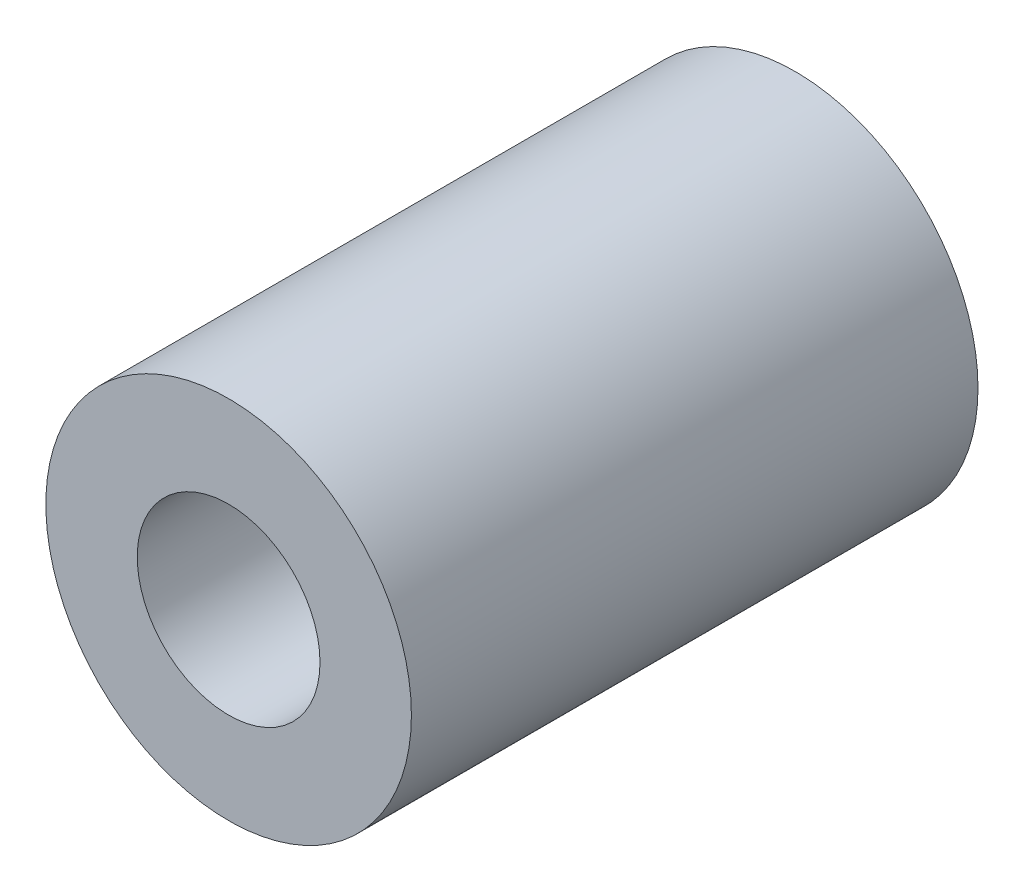
ISO-10303-21;
HEADER;
FILE_DESCRIPTION(('STEP AP214'),'2;1');
FILE_NAME('part.step','',(''),(''),'','','');
FILE_SCHEMA(('AUTOMOTIVE_DESIGN { 1 0 10303 214 1 1 1 1 }'));
ENDSEC;
DATA;
#1=APPLICATION_CONTEXT('core data for automotive mechanical design processes');
#2=APPLICATION_PROTOCOL_DEFINITION('international standard','automotive_design',2000,#1);
#3=PRODUCT_CONTEXT('',#1,'mechanical');
#4=PRODUCT('Part','Part','',(#3));
#5=PRODUCT_RELATED_PRODUCT_CATEGORY('part','',(#4));
#6=PRODUCT_DEFINITION_FORMATION('','',#4);
#7=PRODUCT_DEFINITION_CONTEXT('part definition',#1,'design');
#8=PRODUCT_DEFINITION('design','',#6,#7);
#9=PRODUCT_DEFINITION_SHAPE('','',#8);
#10=(LENGTH_UNIT() NAMED_UNIT(*) SI_UNIT(.MILLI.,.METRE.));
#11=(NAMED_UNIT(*) PLANE_ANGLE_UNIT() SI_UNIT($,.RADIAN.));
#12=(NAMED_UNIT(*) SI_UNIT($,.STERADIAN.) SOLID_ANGLE_UNIT());
#13=UNCERTAINTY_MEASURE_WITH_UNIT(LENGTH_MEASURE(1.E-05),#10,'distance_accuracy_value','');
#14=(GEOMETRIC_REPRESENTATION_CONTEXT(3) GLOBAL_UNCERTAINTY_ASSIGNED_CONTEXT((#13)) GLOBAL_UNIT_ASSIGNED_CONTEXT((#10,
#11,#12)) REPRESENTATION_CONTEXT('',''));
#15=CARTESIAN_POINT('',(0.,0.,0.));
#16=DIRECTION('',(0.,0.,1.));
#17=DIRECTION('',(1.,0.,0.));
#18=AXIS2_PLACEMENT_3D('',#15,#16,#17);
#19=CARTESIAN_POINT('',(0.,0.,-1.00000000000003));
#20=DIRECTION('',(0.,0.,1.));
#21=DIRECTION('',(1.,0.,0.));
#22=AXIS2_PLACEMENT_3D('',#19,#20,#21);
#23=CYLINDRICAL_SURFACE('',#22,10.);
#24=CARTESIAN_POINT('',(0.,0.,-1.00000000000003));
#25=DIRECTION('',(0.,0.,1.));
#26=DIRECTION('',(1.,0.,0.));
#27=AXIS2_PLACEMENT_3D('',#24,#25,#26);
#28=CIRCLE('',#27,10.);
#29=CARTESIAN_POINT('',(10.,0.,-1.00000000000003));
#30=VERTEX_POINT('',#29);
#31=EDGE_CURVE('E11',#30,#30,#28,.T.);
#32=ORIENTED_EDGE('',*,*,#31,.T.);
#33=EDGE_LOOP('',(#32));
#34=FACE_BOUND('',#33,.T.);
#35=CARTESIAN_POINT('',(0.,0.,30.));
#36=DIRECTION('',(0.,0.,1.));
#37=DIRECTION('',(1.,0.,0.));
#38=AXIS2_PLACEMENT_3D('',#35,#36,#37);
#39=CIRCLE('',#38,10.);
#40=CARTESIAN_POINT('',(10.,0.,30.));
#41=VERTEX_POINT('',#40);
#42=EDGE_CURVE('E54',#41,#41,#39,.T.);
#43=ORIENTED_EDGE('',*,*,#42,.F.);
#44=EDGE_LOOP('',(#43));
#45=FACE_BOUND('',#44,.T.);
#46=ADVANCED_FACE('F44',(#34,#45),#23,.T.);
#47=CARTESIAN_POINT('',(0.,0.,-1.00000000000003));
#48=DIRECTION('',(0.,0.,1.));
#49=DIRECTION('',(1.,0.,0.));
#50=AXIS2_PLACEMENT_3D('',#47,#48,#49);
#51=PLANE('',#50);
#52=CARTESIAN_POINT('',(0.,0.,-1.00000000000003));
#53=DIRECTION('',(0.,0.,1.));
#54=DIRECTION('',(1.,0.,0.));
#55=AXIS2_PLACEMENT_3D('',#52,#53,#54);
#56=CIRCLE('',#55,5.);
#57=CARTESIAN_POINT('',(5.,0.,-1.00000000000003));
#58=VERTEX_POINT('',#57);
#59=EDGE_CURVE('E50',#58,#58,#56,.T.);
#60=ORIENTED_EDGE('',*,*,#59,.T.);
#61=EDGE_LOOP('',(#60));
#62=FACE_BOUND('',#61,.T.);
#63=ORIENTED_EDGE('',*,*,#31,.F.);
#64=EDGE_LOOP('',(#63));
#65=FACE_BOUND('',#64,.T.);
#66=ADVANCED_FACE('F73',(#62,#65),#51,.F.);
#67=CARTESIAN_POINT('',(0.,0.,-1.00000000000003));
#68=DIRECTION('',(0.,0.,1.));
#69=DIRECTION('',(1.,0.,0.));
#70=AXIS2_PLACEMENT_3D('',#67,#68,#69);
#71=CYLINDRICAL_SURFACE('',#70,5.);
#72=ORIENTED_EDGE('',*,*,#59,.F.);
#73=EDGE_LOOP('',(#72));
#74=FACE_BOUND('',#73,.T.);
#75=CARTESIAN_POINT('',(0.,0.,30.));
#76=DIRECTION('',(0.,0.,1.));
#77=DIRECTION('',(1.,0.,0.));
#78=AXIS2_PLACEMENT_3D('',#75,#76,#77);
#79=CIRCLE('',#78,5.);
#80=CARTESIAN_POINT('',(5.,0.,30.));
#81=VERTEX_POINT('',#80);
#82=EDGE_CURVE('E58',#81,#81,#79,.T.);
#83=ORIENTED_EDGE('',*,*,#82,.T.);
#84=EDGE_LOOP('',(#83));
#85=FACE_BOUND('',#84,.T.);
#86=ADVANCED_FACE('F64',(#74,#85),#71,.F.);
#87=CARTESIAN_POINT('',(0.,0.,30.));
#88=DIRECTION('',(0.,0.,1.));
#89=DIRECTION('',(1.,0.,0.));
#90=AXIS2_PLACEMENT_3D('',#87,#88,#89);
#91=PLANE('',#90);
#92=ORIENTED_EDGE('',*,*,#42,.T.);
#93=EDGE_LOOP('',(#92));
#94=FACE_BOUND('',#93,.T.);
#95=ORIENTED_EDGE('',*,*,#82,.F.);
#96=EDGE_LOOP('',(#95));
#97=FACE_BOUND('',#96,.T.);
#98=ADVANCED_FACE('F66',(#94,#97),#91,.T.);
#99=CLOSED_SHELL('',(#46,#66,#86,#98));
#100=MANIFOLD_SOLID_BREP('B2',#99);
#101=ADVANCED_BREP_SHAPE_REPRESENTATION('',(#18,#100),#14);
#102=SHAPE_DEFINITION_REPRESENTATION(#9,#101);
ENDSEC;
END-ISO-10303-21;
